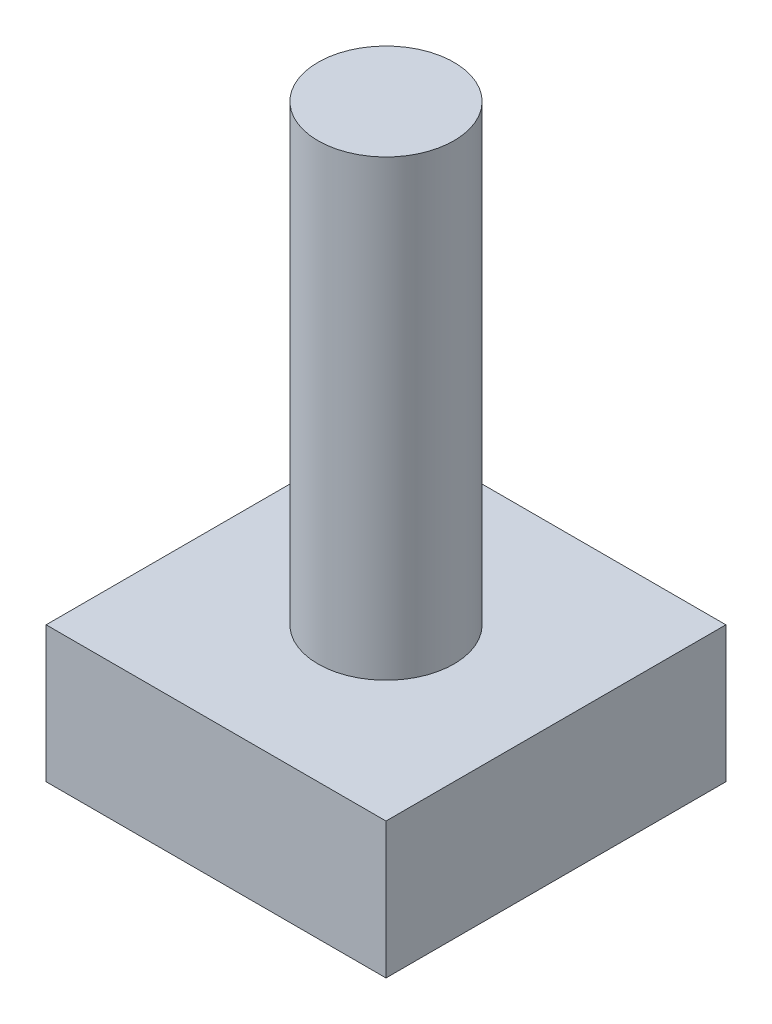
ISO-10303-21;
HEADER;
FILE_DESCRIPTION(('STEP AP214'),'2;1');
FILE_NAME('part.step','',(''),(''),'','','');
FILE_SCHEMA(('AUTOMOTIVE_DESIGN { 1 0 10303 214 1 1 1 1 }'));
ENDSEC;
DATA;
#1=APPLICATION_CONTEXT('core data for automotive mechanical design processes');
#2=APPLICATION_PROTOCOL_DEFINITION('international standard','automotive_design',2000,#1);
#3=PRODUCT_CONTEXT('',#1,'mechanical');
#4=PRODUCT('Part','Part','',(#3));
#5=PRODUCT_RELATED_PRODUCT_CATEGORY('part','',(#4));
#6=PRODUCT_DEFINITION_FORMATION('','',#4);
#7=PRODUCT_DEFINITION_CONTEXT('part definition',#1,'design');
#8=PRODUCT_DEFINITION('design','',#6,#7);
#9=PRODUCT_DEFINITION_SHAPE('','',#8);
#10=(LENGTH_UNIT() NAMED_UNIT(*) SI_UNIT(.MILLI.,.METRE.));
#11=(NAMED_UNIT(*) PLANE_ANGLE_UNIT() SI_UNIT($,.RADIAN.));
#12=(NAMED_UNIT(*) SI_UNIT($,.STERADIAN.) SOLID_ANGLE_UNIT());
#13=UNCERTAINTY_MEASURE_WITH_UNIT(LENGTH_MEASURE(1.E-05),#10,'distance_accuracy_value','');
#14=(GEOMETRIC_REPRESENTATION_CONTEXT(3) GLOBAL_UNCERTAINTY_ASSIGNED_CONTEXT((#13)) GLOBAL_UNIT_ASSIGNED_CONTEXT((#10,
#11,#12)) REPRESENTATION_CONTEXT('',''));
#15=CARTESIAN_POINT('',(0.,0.,0.));
#16=DIRECTION('',(0.,0.,1.));
#17=DIRECTION('',(1.,0.,0.));
#18=AXIS2_PLACEMENT_3D('',#15,#16,#17);
#19=CARTESIAN_POINT('',(0.,6.,0.));
#20=DIRECTION('',(1.,0.,0.));
#21=DIRECTION('',(0.,0.,-1.));
#22=AXIS2_PLACEMENT_3D('',#19,#20,#21);
#23=PLANE('',#22);
#24=DIRECTION('',(0.,0.,1.));
#25=VECTOR('',#24,1.);
#26=CARTESIAN_POINT('',(0.,0.,0.));
#27=LINE('',#26,#25);
#28=CARTESIAN_POINT('',(0.,0.,-15.));
#29=VERTEX_POINT('',#28);
#30=CARTESIAN_POINT('',(0.,0.,0.));
#31=VERTEX_POINT('',#30);
#32=EDGE_CURVE('E100',#29,#31,#27,.T.);
#33=ORIENTED_EDGE('',*,*,#32,.T.);
#34=DIRECTION('',(0.,-1.,0.));
#35=VECTOR('',#34,1.);
#36=CARTESIAN_POINT('',(0.,6.,0.));
#37=LINE('',#36,#35);
#38=CARTESIAN_POINT('',(0.,6.,0.));
#39=VERTEX_POINT('',#38);
#40=EDGE_CURVE('E37',#39,#31,#37,.T.);
#41=ORIENTED_EDGE('',*,*,#40,.F.);
#42=DIRECTION('',(0.,0.,1.));
#43=VECTOR('',#42,1.);
#44=CARTESIAN_POINT('',(0.,6.,0.));
#45=LINE('',#44,#43);
#46=CARTESIAN_POINT('',(0.,6.,-15.));
#47=VERTEX_POINT('',#46);
#48=EDGE_CURVE('E87',#47,#39,#45,.T.);
#49=ORIENTED_EDGE('',*,*,#48,.F.);
#50=DIRECTION('',(0.,-1.,0.));
#51=VECTOR('',#50,1.);
#52=CARTESIAN_POINT('',(0.,6.,-15.));
#53=LINE('',#52,#51);
#54=EDGE_CURVE('E96',#47,#29,#53,.T.);
#55=ORIENTED_EDGE('',*,*,#54,.T.);
#56=EDGE_LOOP('',(#33,#41,#49,#55));
#57=FACE_BOUND('',#56,.T.);
#58=ADVANCED_FACE('F34',(#57),#23,.F.);
#59=CARTESIAN_POINT('',(0.,6.,0.));
#60=DIRECTION('',(0.,0.,-1.));
#61=DIRECTION('',(-1.,0.,0.));
#62=AXIS2_PLACEMENT_3D('',#59,#60,#61);
#63=PLANE('',#62);
#64=DIRECTION('',(1.,0.,0.));
#65=VECTOR('',#64,1.);
#66=CARTESIAN_POINT('',(0.,0.,0.));
#67=LINE('',#66,#65);
#68=CARTESIAN_POINT('',(15.,0.,0.));
#69=VERTEX_POINT('',#68);
#70=EDGE_CURVE('E92',#31,#69,#67,.T.);
#71=ORIENTED_EDGE('',*,*,#70,.T.);
#72=DIRECTION('',(0.,-1.,0.));
#73=VECTOR('',#72,1.);
#74=CARTESIAN_POINT('',(15.,6.,0.));
#75=LINE('',#74,#73);
#76=CARTESIAN_POINT('',(15.,6.,0.));
#77=VERTEX_POINT('',#76);
#78=EDGE_CURVE('E90',#77,#69,#75,.T.);
#79=ORIENTED_EDGE('',*,*,#78,.F.);
#80=DIRECTION('',(1.,0.,0.));
#81=VECTOR('',#80,1.);
#82=CARTESIAN_POINT('',(0.,6.,0.));
#83=LINE('',#82,#81);
#84=EDGE_CURVE('E82',#39,#77,#83,.T.);
#85=ORIENTED_EDGE('',*,*,#84,.F.);
#86=ORIENTED_EDGE('',*,*,#40,.T.);
#87=EDGE_LOOP('',(#71,#79,#85,#86));
#88=FACE_BOUND('',#87,.T.);
#89=ADVANCED_FACE('F91',(#88),#63,.F.);
#90=CARTESIAN_POINT('',(15.,6.,0.));
#91=DIRECTION('',(-1.,0.,0.));
#92=DIRECTION('',(0.,0.,1.));
#93=AXIS2_PLACEMENT_3D('',#90,#91,#92);
#94=PLANE('',#93);
#95=DIRECTION('',(0.,0.,-1.));
#96=VECTOR('',#95,1.);
#97=CARTESIAN_POINT('',(15.,0.,0.));
#98=LINE('',#97,#96);
#99=CARTESIAN_POINT('',(15.,0.,-15.));
#100=VERTEX_POINT('',#99);
#101=EDGE_CURVE('E68',#69,#100,#98,.T.);
#102=ORIENTED_EDGE('',*,*,#101,.T.);
#103=DIRECTION('',(0.,-1.,0.));
#104=VECTOR('',#103,1.);
#105=CARTESIAN_POINT('',(15.,6.,-15.));
#106=LINE('',#105,#104);
#107=CARTESIAN_POINT('',(15.,6.,-15.));
#108=VERTEX_POINT('',#107);
#109=EDGE_CURVE('E93',#108,#100,#106,.T.);
#110=ORIENTED_EDGE('',*,*,#109,.F.);
#111=DIRECTION('',(0.,0.,-1.));
#112=VECTOR('',#111,1.);
#113=CARTESIAN_POINT('',(15.,6.,0.));
#114=LINE('',#113,#112);
#115=EDGE_CURVE('E85',#77,#108,#114,.T.);
#116=ORIENTED_EDGE('',*,*,#115,.F.);
#117=ORIENTED_EDGE('',*,*,#78,.T.);
#118=EDGE_LOOP('',(#102,#110,#116,#117));
#119=FACE_BOUND('',#118,.T.);
#120=ADVANCED_FACE('F94',(#119),#94,.F.);
#121=CARTESIAN_POINT('',(0.,6.,-15.));
#122=DIRECTION('',(0.,0.,1.));
#123=DIRECTION('',(1.,0.,0.));
#124=AXIS2_PLACEMENT_3D('',#121,#122,#123);
#125=PLANE('',#124);
#126=DIRECTION('',(-1.,0.,0.));
#127=VECTOR('',#126,1.);
#128=CARTESIAN_POINT('',(0.,0.,-15.));
#129=LINE('',#128,#127);
#130=EDGE_CURVE('E74',#100,#29,#129,.T.);
#131=ORIENTED_EDGE('',*,*,#130,.T.);
#132=ORIENTED_EDGE('',*,*,#54,.F.);
#133=DIRECTION('',(-1.,0.,0.));
#134=VECTOR('',#133,1.);
#135=CARTESIAN_POINT('',(0.,6.,-15.));
#136=LINE('',#135,#134);
#137=EDGE_CURVE('E51',#108,#47,#136,.T.);
#138=ORIENTED_EDGE('',*,*,#137,.F.);
#139=ORIENTED_EDGE('',*,*,#109,.T.);
#140=EDGE_LOOP('',(#131,#132,#138,#139));
#141=FACE_BOUND('',#140,.T.);
#142=ADVANCED_FACE('F108',(#141),#125,.F.);
#143=CARTESIAN_POINT('',(0.,6.,0.));
#144=DIRECTION('',(0.,-1.,0.));
#145=DIRECTION('',(0.,0.,-1.));
#146=AXIS2_PLACEMENT_3D('',#143,#144,#145);
#147=PLANE('',#146);
#148=CARTESIAN_POINT('',(7.5,6.,-7.5));
#149=DIRECTION('',(0.,1.,0.));
#150=DIRECTION('',(0.,0.,1.));
#151=AXIS2_PLACEMENT_3D('',#148,#149,#150);
#152=CIRCLE('',#151,3.);
#153=CARTESIAN_POINT('',(7.5,6.,-4.5));
#154=VERTEX_POINT('',#153);
#155=EDGE_CURVE('E11',#154,#154,#152,.T.);
#156=ORIENTED_EDGE('',*,*,#155,.F.);
#157=EDGE_LOOP('',(#156));
#158=FACE_BOUND('',#157,.T.);
#159=ORIENTED_EDGE('',*,*,#48,.T.);
#160=ORIENTED_EDGE('',*,*,#84,.T.);
#161=ORIENTED_EDGE('',*,*,#115,.T.);
#162=ORIENTED_EDGE('',*,*,#137,.T.);
#163=EDGE_LOOP('',(#159,#160,#161,#162));
#164=FACE_BOUND('',#163,.T.);
#165=ADVANCED_FACE('F83',(#158,#164),#147,.F.);
#166=CARTESIAN_POINT('',(0.,0.,0.));
#167=DIRECTION('',(0.,-1.,0.));
#168=DIRECTION('',(0.,0.,-1.));
#169=AXIS2_PLACEMENT_3D('',#166,#167,#168);
#170=PLANE('',#169);
#171=ORIENTED_EDGE('',*,*,#32,.F.);
#172=ORIENTED_EDGE('',*,*,#130,.F.);
#173=ORIENTED_EDGE('',*,*,#101,.F.);
#174=ORIENTED_EDGE('',*,*,#70,.F.);
#175=EDGE_LOOP('',(#171,#172,#173,#174));
#176=FACE_BOUND('',#175,.T.);
#177=ADVANCED_FACE('F111',(#176),#170,.T.);
#178=CARTESIAN_POINT('',(7.5,26.,-7.5));
#179=DIRECTION('',(0.,-1.,0.));
#180=DIRECTION('',(0.,0.,-1.));
#181=AXIS2_PLACEMENT_3D('',#178,#179,#180);
#182=CYLINDRICAL_SURFACE('',#181,3.);
#183=CARTESIAN_POINT('',(7.5,26.,-7.5));
#184=DIRECTION('',(0.,1.,0.));
#185=DIRECTION('',(0.,0.,1.));
#186=AXIS2_PLACEMENT_3D('',#183,#184,#185);
#187=CIRCLE('',#186,3.);
#188=CARTESIAN_POINT('',(7.5,26.,-4.5));
#189=VERTEX_POINT('',#188);
#190=EDGE_CURVE('E103',#189,#189,#187,.T.);
#191=ORIENTED_EDGE('',*,*,#190,.F.);
#192=EDGE_LOOP('',(#191));
#193=FACE_BOUND('',#192,.T.);
#194=ORIENTED_EDGE('',*,*,#155,.T.);
#195=EDGE_LOOP('',(#194));
#196=FACE_BOUND('',#195,.T.);
#197=ADVANCED_FACE('F119',(#193,#196),#182,.T.);
#198=CARTESIAN_POINT('',(7.5,26.,-7.5));
#199=DIRECTION('',(0.,1.,0.));
#200=DIRECTION('',(0.,0.,1.));
#201=AXIS2_PLACEMENT_3D('',#198,#199,#200);
#202=PLANE('',#201);
#203=ORIENTED_EDGE('',*,*,#190,.T.);
#204=EDGE_LOOP('',(#203));
#205=FACE_BOUND('',#204,.T.);
#206=ADVANCED_FACE('F117',(#205),#202,.T.);
#207=CLOSED_SHELL('',(#58,#89,#120,#142,#165,#177,#197,#206));
#208=MANIFOLD_SOLID_BREP('B2',#207);
#209=ADVANCED_BREP_SHAPE_REPRESENTATION('',(#18,#208),#14);
#210=SHAPE_DEFINITION_REPRESENTATION(#9,#209);
ENDSEC;
END-ISO-10303-21;
